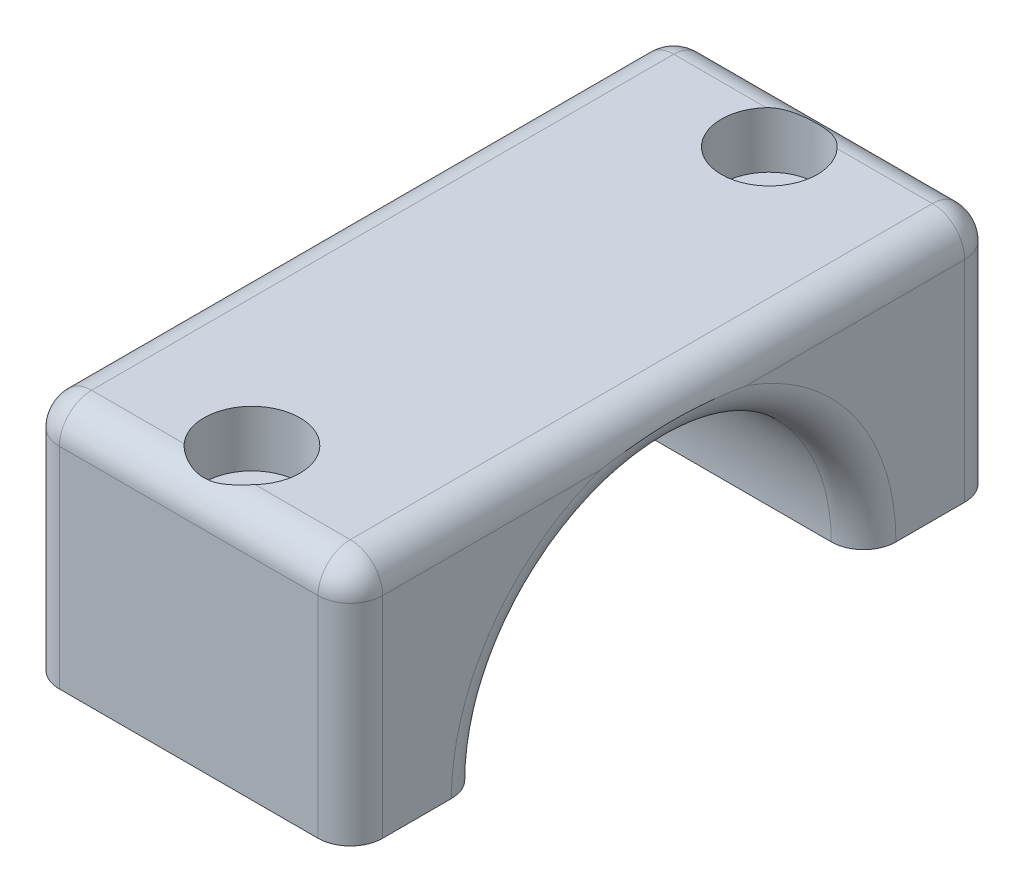
ISO-10303-21;
HEADER;
FILE_DESCRIPTION(('STEP AP214'),'2;1');
FILE_NAME('part.step','',(''),(''),'','','');
FILE_SCHEMA(('AUTOMOTIVE_DESIGN { 1 0 10303 214 1 1 1 1 }'));
ENDSEC;
DATA;
#1=APPLICATION_CONTEXT('core data for automotive mechanical design processes');
#2=APPLICATION_PROTOCOL_DEFINITION('international standard','automotive_design',2000,#1);
#3=PRODUCT_CONTEXT('',#1,'mechanical');
#4=PRODUCT('Part','Part','',(#3));
#5=PRODUCT_RELATED_PRODUCT_CATEGORY('part','',(#4));
#6=PRODUCT_DEFINITION_FORMATION('','',#4);
#7=PRODUCT_DEFINITION_CONTEXT('part definition',#1,'design');
#8=PRODUCT_DEFINITION('design','',#6,#7);
#9=PRODUCT_DEFINITION_SHAPE('','',#8);
#10=(LENGTH_UNIT() NAMED_UNIT(*) SI_UNIT(.MILLI.,.METRE.));
#11=(NAMED_UNIT(*) PLANE_ANGLE_UNIT() SI_UNIT($,.RADIAN.));
#12=(NAMED_UNIT(*) SI_UNIT($,.STERADIAN.) SOLID_ANGLE_UNIT());
#13=UNCERTAINTY_MEASURE_WITH_UNIT(LENGTH_MEASURE(1.E-05),#10,'distance_accuracy_value','');
#14=(GEOMETRIC_REPRESENTATION_CONTEXT(3) GLOBAL_UNCERTAINTY_ASSIGNED_CONTEXT((#13)) GLOBAL_UNIT_ASSIGNED_CONTEXT((#10,
#11,#12)) REPRESENTATION_CONTEXT('',''));
#15=CARTESIAN_POINT('',(0.,0.,0.));
#16=DIRECTION('',(0.,0.,1.));
#17=DIRECTION('',(1.,0.,0.));
#18=AXIS2_PLACEMENT_3D('',#15,#16,#17);
#19=CARTESIAN_POINT('',(0.,0.,0.));
#20=DIRECTION('',(-1.,0.,0.));
#21=DIRECTION('',(0.,0.,1.));
#22=AXIS2_PLACEMENT_3D('',#19,#20,#21);
#23=PLANE('',#22);
#24=DIRECTION('',(0.,0.,-1.));
#25=VECTOR('',#24,1.);
#26=CARTESIAN_POINT('',(0.,0.,0.));
#27=LINE('',#26,#25);
#28=CARTESIAN_POINT('',(0.,0.,-42.8625));
#29=VERTEX_POINT('',#28);
#30=CARTESIAN_POINT('',(0.,0.,-48.26));
#31=VERTEX_POINT('',#30);
#32=EDGE_CURVE('E452',#29,#31,#27,.T.);
#33=ORIENTED_EDGE('',*,*,#32,.F.);
#34=CARTESIAN_POINT('',(0.,0.,-25.4));
#35=DIRECTION('',(-1.,0.,0.));
#36=DIRECTION('',(0.,0.,1.));
#37=AXIS2_PLACEMENT_3D('',#34,#35,#36);
#38=CIRCLE('',#37,17.4625);
#39=CARTESIAN_POINT('',(0.,16.51,-31.0884801353261));
#40=VERTEX_POINT('',#39);
#41=EDGE_CURVE('E262',#29,#40,#38,.F.);
#42=ORIENTED_EDGE('',*,*,#41,.T.);
#43=DIRECTION('',(0.,0.,1.));
#44=VECTOR('',#43,1.);
#45=CARTESIAN_POINT('',(0.,16.51,-50.8));
#46=LINE('',#45,#44);
#47=CARTESIAN_POINT('',(0.,16.51,-48.26));
#48=VERTEX_POINT('',#47);
#49=EDGE_CURVE('E259',#40,#48,#46,.F.);
#50=ORIENTED_EDGE('',*,*,#49,.T.);
#51=DIRECTION('',(0.,1.,0.));
#52=VECTOR('',#51,1.);
#53=CARTESIAN_POINT('',(0.,0.,-48.26));
#54=LINE('',#53,#52);
#55=EDGE_CURVE('E256',#48,#31,#54,.F.);
#56=ORIENTED_EDGE('',*,*,#55,.T.);
#57=EDGE_LOOP('',(#33,#42,#50,#56));
#58=FACE_BOUND('',#57,.T.);
#59=ADVANCED_FACE('F42',(#58),#23,.T.);
#60=CARTESIAN_POINT('',(25.4,0.,0.));
#61=DIRECTION('',(-1.,0.,0.));
#62=DIRECTION('',(0.,0.,1.));
#63=AXIS2_PLACEMENT_3D('',#60,#61,#62);
#64=PLANE('',#63);
#65=DIRECTION('',(0.,0.,1.));
#66=VECTOR('',#65,1.);
#67=CARTESIAN_POINT('',(25.4,16.51,0.));
#68=LINE('',#67,#66);
#69=CARTESIAN_POINT('',(25.4,16.51,-48.26));
#70=VERTEX_POINT('',#69);
#71=CARTESIAN_POINT('',(25.4,16.51,-31.0884801353261));
#72=VERTEX_POINT('',#71);
#73=EDGE_CURVE('E234',#70,#72,#68,.T.);
#74=ORIENTED_EDGE('',*,*,#73,.T.);
#75=CARTESIAN_POINT('',(25.4,0.,-25.4));
#76=DIRECTION('',(-1.,0.,0.));
#77=DIRECTION('',(0.,0.,1.));
#78=AXIS2_PLACEMENT_3D('',#75,#76,#77);
#79=CIRCLE('',#78,17.4625);
#80=CARTESIAN_POINT('',(25.4,0.,-42.8625));
#81=VERTEX_POINT('',#80);
#82=EDGE_CURVE('E237',#72,#81,#79,.T.);
#83=ORIENTED_EDGE('',*,*,#82,.T.);
#84=DIRECTION('',(0.,0.,-1.));
#85=VECTOR('',#84,1.);
#86=CARTESIAN_POINT('',(25.4,0.,0.));
#87=LINE('',#86,#85);
#88=CARTESIAN_POINT('',(25.4,0.,-48.26));
#89=VERTEX_POINT('',#88);
#90=EDGE_CURVE('E180',#81,#89,#87,.T.);
#91=ORIENTED_EDGE('',*,*,#90,.T.);
#92=DIRECTION('',(0.,1.,0.));
#93=VECTOR('',#92,1.);
#94=CARTESIAN_POINT('',(25.4,0.,-48.26));
#95=LINE('',#94,#93);
#96=EDGE_CURVE('E231',#89,#70,#95,.T.);
#97=ORIENTED_EDGE('',*,*,#96,.T.);
#98=EDGE_LOOP('',(#74,#83,#91,#97));
#99=FACE_BOUND('',#98,.T.);
#100=ADVANCED_FACE('F323',(#99),#64,.F.);
#101=CARTESIAN_POINT('',(25.4,0.,0.));
#102=DIRECTION('',(0.,1.,0.));
#103=DIRECTION('',(0.,0.,1.));
#104=AXIS2_PLACEMENT_3D('',#101,#102,#103);
#105=PLANE('',#104);
#106=CARTESIAN_POINT('',(12.5946208289048,0.,-5.08));
#107=DIRECTION('',(0.,1.,0.));
#108=DIRECTION('',(0.,0.,1.));
#109=AXIS2_PLACEMENT_3D('',#106,#107,#108);
#110=CIRCLE('',#109,2.15265000000001);
#111=CARTESIAN_POINT('',(12.5946208289048,0.,-2.92734999999999));
#112=VERTEX_POINT('',#111);
#113=EDGE_CURVE('E431',#112,#112,#110,.T.);
#114=ORIENTED_EDGE('',*,*,#113,.T.);
#115=EDGE_LOOP('',(#114));
#116=FACE_BOUND('',#115,.T.);
#117=DIRECTION('',(1.,0.,0.));
#118=VECTOR('',#117,1.);
#119=CARTESIAN_POINT('',(0.,0.,-10.4775));
#120=LINE('',#119,#118);
#121=CARTESIAN_POINT('',(2.54,0.,-10.4775));
#122=VERTEX_POINT('',#121);
#123=CARTESIAN_POINT('',(22.86,0.,-10.4775));
#124=VERTEX_POINT('',#123);
#125=EDGE_CURVE('E197',#122,#124,#120,.T.);
#126=ORIENTED_EDGE('',*,*,#125,.T.);
#127=CARTESIAN_POINT('',(22.86,0.,-7.9375));
#128=DIRECTION('',(0.,1.,0.));
#129=DIRECTION('',(0.,0.,1.));
#130=AXIS2_PLACEMENT_3D('',#127,#128,#129);
#131=CIRCLE('',#130,2.54);
#132=CARTESIAN_POINT('',(25.4,0.,-7.9375));
#133=VERTEX_POINT('',#132);
#134=EDGE_CURVE('E203',#124,#133,#131,.F.);
#135=ORIENTED_EDGE('',*,*,#134,.T.);
#136=CARTESIAN_POINT('',(25.4,0.,-2.54));
#137=VERTEX_POINT('',#136);
#138=EDGE_CURVE('E455',#137,#133,#87,.T.);
#139=ORIENTED_EDGE('',*,*,#138,.F.);
#140=CARTESIAN_POINT('',(22.86,0.,-2.54));
#141=DIRECTION('',(0.,1.,0.));
#142=DIRECTION('',(0.,0.,1.));
#143=AXIS2_PLACEMENT_3D('',#140,#141,#142);
#144=CIRCLE('',#143,2.54);
#145=CARTESIAN_POINT('',(22.86,0.,0.));
#146=VERTEX_POINT('',#145);
#147=EDGE_CURVE('E209',#137,#146,#144,.F.);
#148=ORIENTED_EDGE('',*,*,#147,.T.);
#149=DIRECTION('',(-1.,0.,0.));
#150=VECTOR('',#149,1.);
#151=CARTESIAN_POINT('',(25.4,0.,0.));
#152=LINE('',#151,#150);
#153=CARTESIAN_POINT('',(2.54,0.,0.));
#154=VERTEX_POINT('',#153);
#155=EDGE_CURVE('E211',#146,#154,#152,.T.);
#156=ORIENTED_EDGE('',*,*,#155,.T.);
#157=CARTESIAN_POINT('',(2.54,0.,-2.54));
#158=DIRECTION('',(0.,1.,0.));
#159=DIRECTION('',(0.,0.,1.));
#160=AXIS2_PLACEMENT_3D('',#157,#158,#159);
#161=CIRCLE('',#160,2.54);
#162=CARTESIAN_POINT('',(0.,0.,-2.54));
#163=VERTEX_POINT('',#162);
#164=EDGE_CURVE('E205',#154,#163,#161,.F.);
#165=ORIENTED_EDGE('',*,*,#164,.T.);
#166=CARTESIAN_POINT('',(0.,0.,-7.9375));
#167=VERTEX_POINT('',#166);
#168=EDGE_CURVE('E456',#163,#167,#27,.T.);
#169=ORIENTED_EDGE('',*,*,#168,.T.);
#170=CARTESIAN_POINT('',(2.54,0.,-7.9375));
#171=DIRECTION('',(0.,1.,0.));
#172=DIRECTION('',(0.,0.,1.));
#173=AXIS2_PLACEMENT_3D('',#170,#171,#172);
#174=CIRCLE('',#173,2.54);
#175=EDGE_CURVE('E217',#167,#122,#174,.F.);
#176=ORIENTED_EDGE('',*,*,#175,.T.);
#177=EDGE_LOOP('',(#126,#135,#139,#148,#156,#165,#169,#176));
#178=FACE_BOUND('',#177,.T.);
#179=ADVANCED_FACE('F338',(#116,#178),#105,.F.);
#180=CARTESIAN_POINT('',(25.4,0.,0.));
#181=DIRECTION('',(0.,0.,-1.));
#182=DIRECTION('',(-1.,0.,0.));
#183=AXIS2_PLACEMENT_3D('',#180,#181,#182);
#184=PLANE('',#183);
#185=ORIENTED_EDGE('',*,*,#155,.F.);
#186=DIRECTION('',(0.,-1.,0.));
#187=VECTOR('',#186,1.);
#188=CARTESIAN_POINT('',(22.86,0.,0.));
#189=LINE('',#188,#187);
#190=CARTESIAN_POINT('',(22.86,16.51,0.));
#191=VERTEX_POINT('',#190);
#192=EDGE_CURVE('E58',#146,#191,#189,.F.);
#193=ORIENTED_EDGE('',*,*,#192,.T.);
#194=DIRECTION('',(-1.,0.,0.));
#195=VECTOR('',#194,1.);
#196=CARTESIAN_POINT('',(25.4,16.51,0.));
#197=LINE('',#196,#195);
#198=CARTESIAN_POINT('',(2.54,16.51,0.));
#199=VERTEX_POINT('',#198);
#200=EDGE_CURVE('E69',#191,#199,#197,.T.);
#201=ORIENTED_EDGE('',*,*,#200,.T.);
#202=DIRECTION('',(0.,-1.,0.));
#203=VECTOR('',#202,1.);
#204=CARTESIAN_POINT('',(2.54,0.,0.));
#205=LINE('',#204,#203);
#206=EDGE_CURVE('E473',#199,#154,#205,.T.);
#207=ORIENTED_EDGE('',*,*,#206,.T.);
#208=EDGE_LOOP('',(#185,#193,#201,#207));
#209=FACE_BOUND('',#208,.T.);
#210=ADVANCED_FACE('F336',(#209),#184,.F.);
#211=CARTESIAN_POINT('',(12.5946208289048,0.,-45.72));
#212=DIRECTION('',(0.,1.,0.));
#213=DIRECTION('',(0.,0.,1.));
#214=AXIS2_PLACEMENT_3D('',#211,#212,#213);
#215=CIRCLE('',#214,2.15265000000001);
#216=CARTESIAN_POINT('',(12.5946208289048,0.,-43.56735));
#217=VERTEX_POINT('',#216);
#218=EDGE_CURVE('E198',#217,#217,#215,.T.);
#219=ORIENTED_EDGE('',*,*,#218,.T.);
#220=EDGE_LOOP('',(#219));
#221=FACE_BOUND('',#220,.T.);
#222=ORIENTED_EDGE('',*,*,#90,.F.);
#223=CARTESIAN_POINT('',(22.86,0.,-42.8625));
#224=DIRECTION('',(0.,1.,0.));
#225=DIRECTION('',(0.,0.,1.));
#226=AXIS2_PLACEMENT_3D('',#223,#224,#225);
#227=CIRCLE('',#226,2.54);
#228=CARTESIAN_POINT('',(22.86,0.,-40.3225));
#229=VERTEX_POINT('',#228);
#230=EDGE_CURVE('E174',#81,#229,#227,.F.);
#231=ORIENTED_EDGE('',*,*,#230,.T.);
#232=DIRECTION('',(1.,0.,0.));
#233=VECTOR('',#232,1.);
#234=CARTESIAN_POINT('',(0.,0.,-40.3225));
#235=LINE('',#234,#233);
#236=CARTESIAN_POINT('',(2.54,0.,-40.3225));
#237=VERTEX_POINT('',#236);
#238=EDGE_CURVE('E177',#229,#237,#235,.F.);
#239=ORIENTED_EDGE('',*,*,#238,.T.);
#240=CARTESIAN_POINT('',(2.54,0.,-42.8625));
#241=DIRECTION('',(0.,1.,0.));
#242=DIRECTION('',(0.,0.,1.));
#243=AXIS2_PLACEMENT_3D('',#240,#241,#242);
#244=CIRCLE('',#243,2.54);
#245=EDGE_CURVE('E186',#237,#29,#244,.F.);
#246=ORIENTED_EDGE('',*,*,#245,.T.);
#247=ORIENTED_EDGE('',*,*,#32,.T.);
#248=CARTESIAN_POINT('',(2.54,0.,-48.26));
#249=DIRECTION('',(0.,1.,0.));
#250=DIRECTION('',(0.,0.,1.));
#251=AXIS2_PLACEMENT_3D('',#248,#249,#250);
#252=CIRCLE('',#251,2.54);
#253=CARTESIAN_POINT('',(2.54,0.,-50.8));
#254=VERTEX_POINT('',#253);
#255=EDGE_CURVE('E240',#31,#254,#252,.F.);
#256=ORIENTED_EDGE('',*,*,#255,.T.);
#257=DIRECTION('',(-1.,0.,0.));
#258=VECTOR('',#257,1.);
#259=CARTESIAN_POINT('',(25.4,0.,-50.8));
#260=LINE('',#259,#258);
#261=CARTESIAN_POINT('',(22.86,0.,-50.8));
#262=VERTEX_POINT('',#261);
#263=EDGE_CURVE('E460',#262,#254,#260,.T.);
#264=ORIENTED_EDGE('',*,*,#263,.F.);
#265=CARTESIAN_POINT('',(22.86,0.,-48.26));
#266=DIRECTION('',(0.,1.,0.));
#267=DIRECTION('',(0.,0.,1.));
#268=AXIS2_PLACEMENT_3D('',#265,#266,#267);
#269=CIRCLE('',#268,2.54);
#270=EDGE_CURVE('E243',#262,#89,#269,.F.);
#271=ORIENTED_EDGE('',*,*,#270,.T.);
#272=EDGE_LOOP('',(#222,#231,#239,#246,#247,#256,#264,#271));
#273=FACE_BOUND('',#272,.T.);
#274=ADVANCED_FACE('F176',(#221,#273),#105,.F.);
#275=CARTESIAN_POINT('',(25.4,0.,-50.8));
#276=DIRECTION('',(0.,0.,1.));
#277=DIRECTION('',(1.,0.,0.));
#278=AXIS2_PLACEMENT_3D('',#275,#276,#277);
#279=PLANE('',#278);
#280=DIRECTION('',(-1.,0.,0.));
#281=VECTOR('',#280,1.);
#282=CARTESIAN_POINT('',(25.4,16.51,-50.8));
#283=LINE('',#282,#281);
#284=CARTESIAN_POINT('',(2.54,16.51,-50.8));
#285=VERTEX_POINT('',#284);
#286=CARTESIAN_POINT('',(22.86,16.51,-50.8));
#287=VERTEX_POINT('',#286);
#288=EDGE_CURVE('E491',#285,#287,#283,.F.);
#289=ORIENTED_EDGE('',*,*,#288,.T.);
#290=DIRECTION('',(0.,1.,0.));
#291=VECTOR('',#290,1.);
#292=CARTESIAN_POINT('',(22.86,0.,-50.8));
#293=LINE('',#292,#291);
#294=EDGE_CURVE('E506',#287,#262,#293,.F.);
#295=ORIENTED_EDGE('',*,*,#294,.T.);
#296=ORIENTED_EDGE('',*,*,#263,.T.);
#297=DIRECTION('',(0.,1.,0.));
#298=VECTOR('',#297,1.);
#299=CARTESIAN_POINT('',(2.54,19.05,-50.8));
#300=LINE('',#299,#298);
#301=EDGE_CURVE('E293',#254,#285,#300,.T.);
#302=ORIENTED_EDGE('',*,*,#301,.T.);
#303=EDGE_LOOP('',(#289,#295,#296,#302));
#304=FACE_BOUND('',#303,.T.);
#305=ADVANCED_FACE('F329',(#304),#279,.F.);
#306=CARTESIAN_POINT('',(25.4,19.05,0.));
#307=DIRECTION('',(0.,-1.,0.));
#308=DIRECTION('',(0.,0.,-1.));
#309=AXIS2_PLACEMENT_3D('',#306,#307,#308);
#310=PLANE('',#309);
#311=DIRECTION('',(0.,0.,1.));
#312=VECTOR('',#311,1.);
#313=CARTESIAN_POINT('',(22.86,19.05,0.));
#314=LINE('',#313,#312);
#315=CARTESIAN_POINT('',(22.86,19.05,-2.54));
#316=VERTEX_POINT('',#315);
#317=CARTESIAN_POINT('',(22.86,19.05,-48.26));
#318=VERTEX_POINT('',#317);
#319=EDGE_CURVE('E277',#316,#318,#314,.F.);
#320=ORIENTED_EDGE('',*,*,#319,.T.);
#321=DIRECTION('',(-1.,0.,0.));
#322=VECTOR('',#321,1.);
#323=CARTESIAN_POINT('',(25.4,19.05,-48.26));
#324=LINE('',#323,#322);
#325=CARTESIAN_POINT('',(15.3813842915798,19.05,-48.26));
#326=VERTEX_POINT('',#325);
#327=EDGE_CURVE('E280',#318,#326,#324,.T.);
#328=ORIENTED_EDGE('',*,*,#327,.T.);
#329=CARTESIAN_POINT('',(12.5946208289048,19.05,-45.72));
#330=DIRECTION('',(0.,1.,0.));
#331=DIRECTION('',(0.,0.,1.));
#332=AXIS2_PLACEMENT_3D('',#329,#330,#331);
#333=CIRCLE('',#332,3.77063);
#334=CARTESIAN_POINT('',(9.80785736622992,19.05,-48.26));
#335=VERTEX_POINT('',#334);
#336=EDGE_CURVE('E435',#335,#326,#333,.T.);
#337=ORIENTED_EDGE('',*,*,#336,.F.);
#338=DIRECTION('',(-1.,0.,0.));
#339=VECTOR('',#338,1.);
#340=CARTESIAN_POINT('',(25.4,19.05,-48.26));
#341=LINE('',#340,#339);
#342=CARTESIAN_POINT('',(2.54,19.05,-48.26));
#343=VERTEX_POINT('',#342);
#344=EDGE_CURVE('E271',#335,#343,#341,.T.);
#345=ORIENTED_EDGE('',*,*,#344,.T.);
#346=DIRECTION('',(0.,0.,1.));
#347=VECTOR('',#346,1.);
#348=CARTESIAN_POINT('',(2.54,19.05,0.));
#349=LINE('',#348,#347);
#350=CARTESIAN_POINT('',(2.54,19.05,-2.54));
#351=VERTEX_POINT('',#350);
#352=EDGE_CURVE('E265',#343,#351,#349,.T.);
#353=ORIENTED_EDGE('',*,*,#352,.T.);
#354=DIRECTION('',(-1.,0.,0.));
#355=VECTOR('',#354,1.);
#356=CARTESIAN_POINT('',(25.4,19.05,-2.54));
#357=LINE('',#356,#355);
#358=CARTESIAN_POINT('',(9.80785736622992,19.05,-2.54));
#359=VERTEX_POINT('',#358);
#360=EDGE_CURVE('E268',#351,#359,#357,.F.);
#361=ORIENTED_EDGE('',*,*,#360,.T.);
#362=CARTESIAN_POINT('',(12.5946208289048,19.05,-5.08));
#363=DIRECTION('',(0.,1.,0.));
#364=DIRECTION('',(0.,0.,1.));
#365=AXIS2_PLACEMENT_3D('',#362,#363,#364);
#366=CIRCLE('',#365,3.77063);
#367=CARTESIAN_POINT('',(15.3813842915798,19.05,-2.54));
#368=VERTEX_POINT('',#367);
#369=EDGE_CURVE('E411',#368,#359,#366,.T.);
#370=ORIENTED_EDGE('',*,*,#369,.F.);
#371=DIRECTION('',(-1.,0.,0.));
#372=VECTOR('',#371,1.);
#373=CARTESIAN_POINT('',(25.4,19.05,-2.54));
#374=LINE('',#373,#372);
#375=EDGE_CURVE('E274',#368,#316,#374,.F.);
#376=ORIENTED_EDGE('',*,*,#375,.T.);
#377=EDGE_LOOP('',(#320,#328,#337,#345,#353,#361,#370,#376));
#378=FACE_BOUND('',#377,.T.);
#379=ADVANCED_FACE('F321',(#378),#310,.F.);
#380=ORIENTED_EDGE('',*,*,#138,.T.);
#381=CARTESIAN_POINT('',(25.4,0.,-25.4));
#382=DIRECTION('',(-1.,0.,0.));
#383=DIRECTION('',(0.,0.,1.));
#384=AXIS2_PLACEMENT_3D('',#381,#382,#383);
#385=CIRCLE('',#384,17.4625);
#386=CARTESIAN_POINT('',(25.4,16.51,-19.7115198646739));
#387=VERTEX_POINT('',#386);
#388=EDGE_CURVE('E228',#133,#387,#385,.T.);
#389=ORIENTED_EDGE('',*,*,#388,.T.);
#390=DIRECTION('',(0.,0.,1.));
#391=VECTOR('',#390,1.);
#392=CARTESIAN_POINT('',(25.4,16.51,0.));
#393=LINE('',#392,#391);
#394=CARTESIAN_POINT('',(25.4,16.51,-2.54));
#395=VERTEX_POINT('',#394);
#396=EDGE_CURVE('E225',#387,#395,#393,.T.);
#397=ORIENTED_EDGE('',*,*,#396,.T.);
#398=DIRECTION('',(0.,-1.,0.));
#399=VECTOR('',#398,1.);
#400=CARTESIAN_POINT('',(25.4,0.,-2.54));
#401=LINE('',#400,#399);
#402=EDGE_CURVE('E222',#395,#137,#401,.T.);
#403=ORIENTED_EDGE('',*,*,#402,.T.);
#404=EDGE_LOOP('',(#380,#389,#397,#403));
#405=FACE_BOUND('',#404,.T.);
#406=ADVANCED_FACE('F318',(#405),#64,.F.);
#407=DIRECTION('',(0.,0.,1.));
#408=VECTOR('',#407,1.);
#409=CARTESIAN_POINT('',(0.,16.51,-50.8));
#410=LINE('',#409,#408);
#411=CARTESIAN_POINT('',(0.,16.51,-2.54));
#412=VERTEX_POINT('',#411);
#413=CARTESIAN_POINT('',(0.,16.51,-19.7115198646739));
#414=VERTEX_POINT('',#413);
#415=EDGE_CURVE('E250',#412,#414,#410,.F.);
#416=ORIENTED_EDGE('',*,*,#415,.T.);
#417=CARTESIAN_POINT('',(0.,0.,-25.4));
#418=DIRECTION('',(-1.,0.,0.));
#419=DIRECTION('',(0.,0.,1.));
#420=AXIS2_PLACEMENT_3D('',#417,#418,#419);
#421=CIRCLE('',#420,17.4625);
#422=EDGE_CURVE('E253',#414,#167,#421,.F.);
#423=ORIENTED_EDGE('',*,*,#422,.T.);
#424=ORIENTED_EDGE('',*,*,#168,.F.);
#425=DIRECTION('',(0.,-1.,0.));
#426=VECTOR('',#425,1.);
#427=CARTESIAN_POINT('',(0.,19.05,-2.54));
#428=LINE('',#427,#426);
#429=EDGE_CURVE('E185',#163,#412,#428,.F.);
#430=ORIENTED_EDGE('',*,*,#429,.T.);
#431=EDGE_LOOP('',(#416,#423,#424,#430));
#432=FACE_BOUND('',#431,.T.);
#433=ADVANCED_FACE('F317',(#432),#23,.T.);
#434=CARTESIAN_POINT('',(0.,0.,-25.4));
#435=DIRECTION('',(1.,0.,0.));
#436=DIRECTION('',(0.,0.,-1.));
#437=AXIS2_PLACEMENT_3D('',#434,#435,#436);
#438=CYLINDRICAL_SURFACE('',#437,14.9225);
#439=ORIENTED_EDGE('',*,*,#238,.F.);
#440=CARTESIAN_POINT('',(22.86,0.,-25.4));
#441=DIRECTION('',(-1.,0.,0.));
#442=DIRECTION('',(0.,0.,1.));
#443=AXIS2_PLACEMENT_3D('',#440,#441,#442);
#444=CIRCLE('',#443,14.9225);
#445=EDGE_CURVE('E192',#229,#124,#444,.F.);
#446=ORIENTED_EDGE('',*,*,#445,.T.);
#447=ORIENTED_EDGE('',*,*,#125,.F.);
#448=CARTESIAN_POINT('',(2.54,0.,-25.4));
#449=DIRECTION('',(-1.,0.,0.));
#450=DIRECTION('',(0.,0.,1.));
#451=AXIS2_PLACEMENT_3D('',#448,#449,#450);
#452=CIRCLE('',#451,14.9225);
#453=EDGE_CURVE('E195',#122,#237,#452,.T.);
#454=ORIENTED_EDGE('',*,*,#453,.T.);
#455=EDGE_LOOP('',(#439,#446,#447,#454));
#456=FACE_BOUND('',#455,.T.);
#457=ADVANCED_FACE('F190',(#456),#438,.F.);
#458=CARTESIAN_POINT('',(12.5946208289048,19.05,-45.72));
#459=DIRECTION('',(0.,1.,0.));
#460=DIRECTION('',(0.,0.,1.));
#461=AXIS2_PLACEMENT_3D('',#458,#459,#460);
#462=CYLINDRICAL_SURFACE('',#461,2.15265);
#463=ORIENTED_EDGE('',*,*,#218,.F.);
#464=EDGE_LOOP('',(#463));
#465=FACE_BOUND('',#464,.T.);
#466=CARTESIAN_POINT('',(12.5946208289048,14.6558,-45.72));
#467=DIRECTION('',(0.,1.,0.));
#468=DIRECTION('',(0.,0.,1.));
#469=AXIS2_PLACEMENT_3D('',#466,#467,#468);
#470=CIRCLE('',#469,2.15265);
#471=CARTESIAN_POINT('',(12.5946208289048,14.6558,-43.56735));
#472=VERTEX_POINT('',#471);
#473=EDGE_CURVE('E443',#472,#472,#470,.T.);
#474=ORIENTED_EDGE('',*,*,#473,.T.);
#475=EDGE_LOOP('',(#474));
#476=FACE_BOUND('',#475,.T.);
#477=ADVANCED_FACE('F310',(#465,#476),#462,.F.);
#478=CARTESIAN_POINT('',(14.7472708289048,14.6558,-45.72));
#479=DIRECTION('',(0.,-1.,0.));
#480=DIRECTION('',(0.,0.,-1.));
#481=AXIS2_PLACEMENT_3D('',#478,#479,#480);
#482=PLANE('',#481);
#483=ORIENTED_EDGE('',*,*,#473,.F.);
#484=EDGE_LOOP('',(#483));
#485=FACE_BOUND('',#484,.T.);
#486=CARTESIAN_POINT('',(12.5946208289048,14.6558,-45.72));
#487=DIRECTION('',(0.,1.,0.));
#488=DIRECTION('',(0.,0.,1.));
#489=AXIS2_PLACEMENT_3D('',#486,#487,#488);
#490=CIRCLE('',#489,3.77063);
#491=CARTESIAN_POINT('',(12.5946208289048,14.6558,-41.94937));
#492=VERTEX_POINT('',#491);
#493=EDGE_CURVE('E439',#492,#492,#490,.T.);
#494=ORIENTED_EDGE('',*,*,#493,.T.);
#495=EDGE_LOOP('',(#494));
#496=FACE_BOUND('',#495,.T.);
#497=ADVANCED_FACE('F305',(#485,#496),#482,.F.);
#498=CARTESIAN_POINT('',(12.5946208289048,19.05,-45.72));
#499=DIRECTION('',(0.,1.,0.));
#500=DIRECTION('',(0.,0.,1.));
#501=AXIS2_PLACEMENT_3D('',#498,#499,#500);
#502=CYLINDRICAL_SURFACE('',#501,3.77063);
#503=ORIENTED_EDGE('',*,*,#493,.F.);
#504=EDGE_LOOP('',(#503));
#505=FACE_BOUND('',#504,.T.);
#506=ORIENTED_EDGE('',*,*,#336,.T.);
#507=CARTESIAN_POINT('',(15.3813842915798,19.05,-48.26));
#508=CARTESIAN_POINT('',(15.3080520427791,19.0499900330073,-48.3404861586849));
#509=CARTESIAN_POINT('',(15.2312874852604,19.0461772158392,-48.4176791885479));
#510=CARTESIAN_POINT('',(15.0717897408338,19.0327253562551,-48.5648191956909));
#511=CARTESIAN_POINT('',(14.9890667381085,19.0230960565977,-48.6347780613824));
#512=CARTESIAN_POINT('',(14.8184875250494,18.9998047364336,-48.7669155792167));
#513=CARTESIAN_POINT('',(14.7306431165243,18.9861517148356,-48.8291111564698));
#514=CARTESIAN_POINT('',(14.5502654527886,18.9564533599598,-48.9456235879597));
#515=CARTESIAN_POINT('',(14.4577305213677,18.94040716742,-48.9999375984633));
#516=CARTESIAN_POINT('',(14.1940215477048,18.8945762530219,-49.1399631057879));
#517=CARTESIAN_POINT('',(14.0181556405014,18.8638978583135,-49.2168378327073));
#518=CARTESIAN_POINT('',(13.74673682327,18.8223468362823,-49.3115860028274));
#519=CARTESIAN_POINT('',(13.6549628778053,18.8092373961355,-49.3397472027104));
#520=CARTESIAN_POINT('',(13.4692509797454,18.7854362602128,-49.3890445342811));
#521=CARTESIAN_POINT('',(13.3753140186119,18.7747434800981,-49.4101838186625));
#522=CARTESIAN_POINT('',(13.176590217607,18.7557133170279,-49.4469477348102));
#523=CARTESIAN_POINT('',(13.0716347864068,18.7477050123855,-49.4618385535159));
#524=CARTESIAN_POINT('',(12.8605833208545,18.7363575623638,-49.4827326123262));
#525=CARTESIAN_POINT('',(12.7544872819049,18.7330184358118,-49.4887358165936));
#526=CARTESIAN_POINT('',(12.5421877596963,18.7313449365675,-49.4917588925848));
#527=CARTESIAN_POINT('',(12.4359843728738,18.7330076964472,-49.4887839112237));
#528=CARTESIAN_POINT('',(12.2244003055153,18.7411645096479,-49.4739092689426));
#529=CARTESIAN_POINT('',(12.1190195915896,18.7476583658493,-49.4620099721549));
#530=CARTESIAN_POINT('',(11.9219763105278,18.7638515875336,-49.4313302458349));
#531=CARTESIAN_POINT('',(11.8301267912632,18.7730977929495,-49.4134957417934));
#532=CARTESIAN_POINT('',(11.6482761977089,18.7941912367456,-49.3711372264977));
#533=CARTESIAN_POINT('',(11.5582757041584,18.8060392790516,-49.3466111470849));
#534=CARTESIAN_POINT('',(11.2914447685517,18.8443090397349,-49.2631836860609));
#535=CARTESIAN_POINT('',(11.1180035339161,18.8734349659221,-49.1944675834051));
#536=CARTESIAN_POINT('',(10.7647352551622,18.9344757234976,-49.0232936095011));
#537=CARTESIAN_POINT('',(10.5862716690131,18.9663486300446,-48.9179749847991));
#538=CARTESIAN_POINT('',(10.3328707830189,19.0052204817045,-48.7387446557788));
#539=CARTESIAN_POINT('',(10.2508877615049,19.0166786710074,-48.6755591539725));
#540=CARTESIAN_POINT('',(10.092136396857,19.0351457589363,-48.5423970924458));
#541=CARTESIAN_POINT('',(10.0153629634122,19.042159058254,-48.4724273289318));
#542=CARTESIAN_POINT('',(9.91869482266076,19.0474186316503,-48.3767102239969));
#543=CARTESIAN_POINT('',(9.89611310205699,19.0483749823596,-48.3537699893348));
#544=CARTESIAN_POINT('',(9.85153978352871,19.0496655272492,-48.3073136167821));
#545=CARTESIAN_POINT('',(9.8295480886678,19.0499998242524,-48.2837975747212));
#546=CARTESIAN_POINT('',(9.80785736622992,19.05,-48.26));
#547=B_SPLINE_CURVE_WITH_KNOTS('',3,(#507,#508,#509,#510,#511,#512,#513,#514,#515,#516,#517,
#518,#519,#520,#521,#522,#523,#524,#525,#526,#527,#528,#529,#530,#531,#532,#533,#534,#535,#536,
#537,#538,#539,#540,#541,#542,#543,#544,#545,#546),.UNSPECIFIED.,.F.,.F.,(4,2,2,2,2,2,2,2,2,2,2,
2,2,2,2,2,2,2,2,4),(0.,0.326306164795723,0.652067268152037,0.977105276869988,1.3022602718867,
1.88274728800758,2.17317931767882,2.46348077261036,2.78194123409229,3.10040297968255,
3.41868219572245,3.7369484259569,4.01870583239246,4.3005504201486,4.86489956171498,
5.49074220862864,5.80281835954248,6.11458505281981,6.21118523839865,6.30776945494839),.UNSPECIFIED.);
#548=EDGE_CURVE('E284',#326,#335,#547,.T.);
#549=ORIENTED_EDGE('',*,*,#548,.T.);
#550=EDGE_LOOP('',(#506,#549));
#551=FACE_BOUND('',#550,.T.);
#552=ADVANCED_FACE('F299',(#505,#551),#502,.F.);
#553=CARTESIAN_POINT('',(12.5946208289048,19.05,-5.08));
#554=DIRECTION('',(0.,1.,0.));
#555=DIRECTION('',(0.,0.,1.));
#556=AXIS2_PLACEMENT_3D('',#553,#554,#555);
#557=CYLINDRICAL_SURFACE('',#556,2.15265);
#558=ORIENTED_EDGE('',*,*,#113,.F.);
#559=EDGE_LOOP('',(#558));
#560=FACE_BOUND('',#559,.T.);
#561=CARTESIAN_POINT('',(12.5946208289048,14.6558,-5.08));
#562=DIRECTION('',(0.,1.,0.));
#563=DIRECTION('',(0.,0.,1.));
#564=AXIS2_PLACEMENT_3D('',#561,#562,#563);
#565=CIRCLE('',#564,2.15265);
#566=CARTESIAN_POINT('',(12.5946208289048,14.6558,-2.92735));
#567=VERTEX_POINT('',#566);
#568=EDGE_CURVE('E425',#567,#567,#565,.T.);
#569=ORIENTED_EDGE('',*,*,#568,.T.);
#570=EDGE_LOOP('',(#569));
#571=FACE_BOUND('',#570,.T.);
#572=ADVANCED_FACE('F304',(#560,#571),#557,.F.);
#573=CARTESIAN_POINT('',(14.7472708289048,14.6558,-5.08));
#574=DIRECTION('',(0.,-1.,0.));
#575=DIRECTION('',(0.,0.,-1.));
#576=AXIS2_PLACEMENT_3D('',#573,#574,#575);
#577=PLANE('',#576);
#578=ORIENTED_EDGE('',*,*,#568,.F.);
#579=EDGE_LOOP('',(#578));
#580=FACE_BOUND('',#579,.T.);
#581=CARTESIAN_POINT('',(12.5946208289048,14.6558,-5.08));
#582=DIRECTION('',(0.,1.,0.));
#583=DIRECTION('',(0.,0.,1.));
#584=AXIS2_PLACEMENT_3D('',#581,#582,#583);
#585=CIRCLE('',#584,3.77063);
#586=CARTESIAN_POINT('',(12.5946208289048,14.6558,-1.30937));
#587=VERTEX_POINT('',#586);
#588=EDGE_CURVE('E418',#587,#587,#585,.T.);
#589=ORIENTED_EDGE('',*,*,#588,.T.);
#590=EDGE_LOOP('',(#589));
#591=FACE_BOUND('',#590,.T.);
#592=ADVANCED_FACE('F550',(#580,#591),#577,.F.);
#593=CARTESIAN_POINT('',(12.5946208289048,19.05,-5.08));
#594=DIRECTION('',(0.,1.,0.));
#595=DIRECTION('',(0.,0.,1.));
#596=AXIS2_PLACEMENT_3D('',#593,#594,#595);
#597=CYLINDRICAL_SURFACE('',#596,3.77063);
#598=ORIENTED_EDGE('',*,*,#588,.F.);
#599=EDGE_LOOP('',(#598));
#600=FACE_BOUND('',#599,.T.);
#601=ORIENTED_EDGE('',*,*,#369,.T.);
#602=CARTESIAN_POINT('',(9.80785736622992,19.05,-2.54));
#603=CARTESIAN_POINT('',(9.88118961503059,19.0499900330073,-2.45951384131513));
#604=CARTESIAN_POINT('',(9.9579541725493,19.0461772158392,-2.38232081145215));
#605=CARTESIAN_POINT('',(10.1174519169759,19.0327253562551,-2.23518080430906));
#606=CARTESIAN_POINT('',(10.2001749197012,19.0230960565977,-2.16522193861759));
#607=CARTESIAN_POINT('',(10.3707541327603,18.9998047364336,-2.03308442078327));
#608=CARTESIAN_POINT('',(10.4585985412854,18.9861517148356,-1.97088884353019));
#609=CARTESIAN_POINT('',(10.6389762050211,18.9564533599598,-1.85437641204029));
#610=CARTESIAN_POINT('',(10.731511136442,18.94040716742,-1.80006240153675));
#611=CARTESIAN_POINT('',(10.9952201101049,18.8945762530219,-1.66003689421211));
#612=CARTESIAN_POINT('',(11.1710860173083,18.8638978583135,-1.58316216729271));
#613=CARTESIAN_POINT('',(11.4425048345397,18.8223468362823,-1.48841399717259));
#614=CARTESIAN_POINT('',(11.5342787800045,18.8092373961355,-1.46025279728958));
#615=CARTESIAN_POINT('',(11.7199906780643,18.7854362602128,-1.41095546571892));
#616=CARTESIAN_POINT('',(11.8139276391978,18.7747434800981,-1.38981618133749));
#617=CARTESIAN_POINT('',(12.0126514402027,18.7557133170279,-1.35305226518983));
#618=CARTESIAN_POINT('',(12.1176068714029,18.7477050123855,-1.33816144648408));
#619=CARTESIAN_POINT('',(12.3286583369552,18.7363575623638,-1.3172673876738));
#620=CARTESIAN_POINT('',(12.4347543759048,18.7330184358118,-1.31126418340635));
#621=CARTESIAN_POINT('',(12.6470538981134,18.7313449365675,-1.30824110741523));
#622=CARTESIAN_POINT('',(12.7532572849359,18.7330076964472,-1.31121608877635));
#623=CARTESIAN_POINT('',(12.9648413522944,18.7411645096479,-1.32609073105743));
#624=CARTESIAN_POINT('',(13.0702220662201,18.7476583658493,-1.33799002784513));
#625=CARTESIAN_POINT('',(13.2672653472819,18.7638515875336,-1.36866975416505));
#626=CARTESIAN_POINT('',(13.3591148665465,18.7730977929495,-1.38650425820659));
#627=CARTESIAN_POINT('',(13.5409654601008,18.7941912367456,-1.42886277350234));
#628=CARTESIAN_POINT('',(13.6309659536513,18.8060392790516,-1.45338885291505));
#629=CARTESIAN_POINT('',(13.897796889258,18.8443090397349,-1.5368163139391));
#630=CARTESIAN_POINT('',(14.0712381238936,18.8734349659221,-1.60553241659486));
#631=CARTESIAN_POINT('',(14.4245064026475,18.9344757234976,-1.77670639049888));
#632=CARTESIAN_POINT('',(14.6029699887966,18.9663486300446,-1.88202501520087));
#633=CARTESIAN_POINT('',(14.8563708747908,19.0052204817045,-2.06125534422117));
#634=CARTESIAN_POINT('',(14.9383538963048,19.0166786710074,-2.12444084602752));
#635=CARTESIAN_POINT('',(15.0971052609527,19.0351457589363,-2.25760290755416));
#636=CARTESIAN_POINT('',(15.1738786943975,19.042159058254,-2.32757267106816));
#637=CARTESIAN_POINT('',(15.2705468351489,19.0474186316503,-2.42328977600306));
#638=CARTESIAN_POINT('',(15.2931285557527,19.0483749823596,-2.44623001066516));
#639=CARTESIAN_POINT('',(15.337701874281,19.0496655272492,-2.49268638321794));
#640=CARTESIAN_POINT('',(15.3596935691419,19.0499998242524,-2.51620242527883));
#641=CARTESIAN_POINT('',(15.3813842915798,19.05,-2.54));
#642=B_SPLINE_CURVE_WITH_KNOTS('',3,(#602,#603,#604,#605,#606,#607,#608,#609,#610,#611,#612,
#613,#614,#615,#616,#617,#618,#619,#620,#621,#622,#623,#624,#625,#626,#627,#628,#629,#630,#631,
#632,#633,#634,#635,#636,#637,#638,#639,#640,#641),.UNSPECIFIED.,.F.,.F.,(4,2,2,2,2,2,2,2,2,2,2,
2,2,2,2,2,2,2,2,4),(0.,0.326306164795723,0.652067268152033,0.977105276869983,1.3022602718867,
1.88274728800758,2.17317931767882,2.46348077261036,2.78194123409228,3.10040297968255,
3.41868219572245,3.73694842595689,4.01870583239246,4.3005504201486,4.86489956171498,
5.49074220862864,5.80281835954247,6.11458505281981,6.21118523839865,6.30776945494839),.UNSPECIFIED.);
#643=EDGE_CURVE('E11',#359,#368,#642,.T.);
#644=ORIENTED_EDGE('',*,*,#643,.T.);
#645=EDGE_LOOP('',(#601,#644));
#646=FACE_BOUND('',#645,.T.);
#647=ADVANCED_FACE('F544',(#600,#646),#597,.F.);
#648=CARTESIAN_POINT('',(2.54,0.,-25.4));
#649=DIRECTION('',(-1.,0.,0.));
#650=DIRECTION('',(0.,0.,1.));
#651=AXIS2_PLACEMENT_3D('',#648,#649,#650);
#652=TOROIDAL_SURFACE('',#651,17.4625,2.54);
#653=ORIENTED_EDGE('',*,*,#175,.F.);
#654=ORIENTED_EDGE('',*,*,#422,.F.);
#655=CARTESIAN_POINT('',(0.,16.51,-19.7115198646739));
#656=CARTESIAN_POINT('',(6.19475706838487E-09,16.5109721757738,-19.7173258467422));
#657=CARTESIAN_POINT('',(5.64166528568118E-07,16.5119429041782,-19.7231320787853));
#658=CARTESIAN_POINT('',(8.14023230243209E-05,16.5828341145455,-20.1478063053544));
#659=CARTESIAN_POINT('',(0.00300928094063641,16.6452216950716,-20.5679704498431));
#660=CARTESIAN_POINT('',(0.0112091267308309,16.754589916855,-21.4103162695576));
#661=CARTESIAN_POINT('',(0.0164814577514755,16.8015681646885,-21.8324982478771));
#662=CARTESIAN_POINT('',(0.0267658977002802,16.8798868978488,-22.6786149962683));
#663=CARTESIAN_POINT('',(0.0317778239157892,16.9112165326424,-23.102550777603));
#664=CARTESIAN_POINT('',(0.0397083463227468,16.9580120685356,-23.9513111564553));
#665=CARTESIAN_POINT('',(0.0426270225196492,16.9734785759445,-24.3761357193804));
#666=CARTESIAN_POINT('',(0.044922127159882,16.9855969974486,-25.0634822611202));
#667=CARTESIAN_POINT('',(0.0452264967352415,16.9871829237343,-25.325924035894));
#668=CARTESIAN_POINT('',(0.0446700993198781,16.9842728125939,-25.8507787587087));
#669=CARTESIAN_POINT('',(0.0438093182828909,16.9797767018469,-26.113191706364));
#670=CARTESIAN_POINT('',(0.0410207171879183,16.9647107375491,-26.6378661761993));
#671=CARTESIAN_POINT('',(0.0390927800844911,16.9541402177535,-26.9001276786097));
#672=CARTESIAN_POINT('',(0.034418889343037,16.9269489737151,-27.4243318230481));
#673=CARTESIAN_POINT('',(0.0316729153516359,16.9103280989324,-27.6862744569795));
#674=CARTESIAN_POINT('',(0.0227339858564791,16.851467502947,-28.4710413440058));
#675=CARTESIAN_POINT('',(0.015836922223944,16.8002182668886,-28.993203562839));
#676=CARTESIAN_POINT('',(0.00452017894668966,16.6741095350335,-30.0345920406838));
#677=CARTESIAN_POINT('',(9.98896293209931E-05,16.599255856706,-30.5538189910502));
#678=CARTESIAN_POINT('',(5.66849113742037E-07,16.5119429043173,-31.076867922169));
#679=CARTESIAN_POINT('',(8.91005220769203E-09,16.5109721759162,-31.0826741542017));
#680=CARTESIAN_POINT('',(0.,16.51,-31.0884801353261));
#681=B_SPLINE_CURVE_WITH_KNOTS('',3,(#655,#656,#657,#658,#659,#660,#661,#662,#663,#664,#665,
#666,#667,#668,#669,#670,#671,#672,#673,#674,#675,#676,#677,#678,#679,#680),.UNSPECIFIED.,.F.,
.F.,(4,2,2,2,2,2,2,2,2,2,2,2,4),(0.,0.0176604577494977,1.29164997239335,2.56583727330224,
3.84090685591104,5.1159277018869,5.90320250012367,6.69048678929518,7.47785744474868,
8.26524769221367,9.83883189403581,11.4120285784394,11.4296890361895),.UNSPECIFIED.);
#682=EDGE_CURVE('E46',#40,#414,#681,.F.);
#683=ORIENTED_EDGE('',*,*,#682,.F.);
#684=ORIENTED_EDGE('',*,*,#41,.F.);
#685=ORIENTED_EDGE('',*,*,#245,.F.);
#686=ORIENTED_EDGE('',*,*,#453,.F.);
#687=EDGE_LOOP('',(#653,#654,#683,#684,#685,#686));
#688=FACE_BOUND('',#687,.T.);
#689=ADVANCED_FACE('F542',(#688),#652,.T.);
#690=CARTESIAN_POINT('',(2.54,0.,-2.54));
#691=DIRECTION('',(0.,1.,0.));
#692=DIRECTION('',(0.,0.,1.));
#693=AXIS2_PLACEMENT_3D('',#690,#691,#692);
#694=CYLINDRICAL_SURFACE('',#693,2.54);
#695=ORIENTED_EDGE('',*,*,#164,.F.);
#696=ORIENTED_EDGE('',*,*,#206,.F.);
#697=CARTESIAN_POINT('',(2.54,16.51,-2.54));
#698=DIRECTION('',(0.,1.,0.));
#699=DIRECTION('',(0.,0.,1.));
#700=AXIS2_PLACEMENT_3D('',#697,#698,#699);
#701=CIRCLE('',#700,2.54);
#702=EDGE_CURVE('E403',#412,#199,#701,.T.);
#703=ORIENTED_EDGE('',*,*,#702,.F.);
#704=ORIENTED_EDGE('',*,*,#429,.F.);
#705=EDGE_LOOP('',(#695,#696,#703,#704));
#706=FACE_BOUND('',#705,.T.);
#707=ADVANCED_FACE('F44',(#706),#694,.T.);
#708=CARTESIAN_POINT('',(2.54,16.51,0.));
#709=DIRECTION('',(0.,0.,-1.));
#710=DIRECTION('',(-1.,0.,0.));
#711=AXIS2_PLACEMENT_3D('',#708,#709,#710);
#712=CYLINDRICAL_SURFACE('',#711,2.54);
#713=ORIENTED_EDGE('',*,*,#682,.T.);
#714=ORIENTED_EDGE('',*,*,#415,.F.);
#715=CARTESIAN_POINT('',(2.54,16.51,-2.54));
#716=DIRECTION('',(0.,0.,1.));
#717=DIRECTION('',(1.,0.,0.));
#718=AXIS2_PLACEMENT_3D('',#715,#716,#717);
#719=CIRCLE('',#718,2.54);
#720=EDGE_CURVE('E400',#351,#412,#719,.T.);
#721=ORIENTED_EDGE('',*,*,#720,.F.);
#722=ORIENTED_EDGE('',*,*,#352,.F.);
#723=CARTESIAN_POINT('',(2.54,16.51,-48.26));
#724=DIRECTION('',(0.,0.,-1.));
#725=DIRECTION('',(-1.,0.,0.));
#726=AXIS2_PLACEMENT_3D('',#723,#724,#725);
#727=CIRCLE('',#726,2.54);
#728=EDGE_CURVE('E396',#48,#343,#727,.T.);
#729=ORIENTED_EDGE('',*,*,#728,.F.);
#730=ORIENTED_EDGE('',*,*,#49,.F.);
#731=EDGE_LOOP('',(#713,#714,#721,#722,#729,#730));
#732=FACE_BOUND('',#731,.T.);
#733=ADVANCED_FACE('F476',(#732),#712,.T.);
#734=CARTESIAN_POINT('',(2.54,0.,-48.26));
#735=DIRECTION('',(0.,-1.,0.));
#736=DIRECTION('',(0.,0.,-1.));
#737=AXIS2_PLACEMENT_3D('',#734,#735,#736);
#738=CYLINDRICAL_SURFACE('',#737,2.54);
#739=ORIENTED_EDGE('',*,*,#255,.F.);
#740=ORIENTED_EDGE('',*,*,#55,.F.);
#741=CARTESIAN_POINT('',(2.54,16.51,-48.26));
#742=DIRECTION('',(0.,1.,0.));
#743=DIRECTION('',(0.,0.,1.));
#744=AXIS2_PLACEMENT_3D('',#741,#742,#743);
#745=CIRCLE('',#744,2.54);
#746=EDGE_CURVE('E392',#285,#48,#745,.T.);
#747=ORIENTED_EDGE('',*,*,#746,.F.);
#748=ORIENTED_EDGE('',*,*,#301,.F.);
#749=EDGE_LOOP('',(#739,#740,#747,#748));
#750=FACE_BOUND('',#749,.T.);
#751=ADVANCED_FACE('F501',(#750),#738,.T.);
#752=CARTESIAN_POINT('',(2.54,16.51,-2.54));
#753=DIRECTION('',(-1.,0.,0.));
#754=DIRECTION('',(0.,0.,1.));
#755=AXIS2_PLACEMENT_3D('',#752,#753,#754);
#756=SPHERICAL_SURFACE('',#755,2.54);
#757=ORIENTED_EDGE('',*,*,#720,.T.);
#758=ORIENTED_EDGE('',*,*,#702,.T.);
#759=CARTESIAN_POINT('',(2.54,16.51,-2.54));
#760=DIRECTION('',(-1.,0.,0.));
#761=DIRECTION('',(0.,0.,1.));
#762=AXIS2_PLACEMENT_3D('',#759,#760,#761);
#763=CIRCLE('',#762,2.54);
#764=EDGE_CURVE('E388',#351,#199,#763,.F.);
#765=ORIENTED_EDGE('',*,*,#764,.F.);
#766=EDGE_LOOP('',(#757,#758,#765));
#767=FACE_BOUND('',#766,.T.);
#768=ADVANCED_FACE('F480',(#767),#756,.T.);
#769=CARTESIAN_POINT('',(2.54,16.51,-48.26));
#770=DIRECTION('',(-1.,0.,0.));
#771=DIRECTION('',(0.,0.,1.));
#772=AXIS2_PLACEMENT_3D('',#769,#770,#771);
#773=SPHERICAL_SURFACE('',#772,2.54);
#774=ORIENTED_EDGE('',*,*,#746,.T.);
#775=ORIENTED_EDGE('',*,*,#728,.T.);
#776=CARTESIAN_POINT('',(2.54,16.51,-48.26));
#777=DIRECTION('',(-1.,0.,0.));
#778=DIRECTION('',(0.,0.,1.));
#779=AXIS2_PLACEMENT_3D('',#776,#777,#778);
#780=CIRCLE('',#779,2.54);
#781=EDGE_CURVE('E384',#285,#343,#780,.F.);
#782=ORIENTED_EDGE('',*,*,#781,.F.);
#783=EDGE_LOOP('',(#774,#775,#782));
#784=FACE_BOUND('',#783,.T.);
#785=ADVANCED_FACE('F493',(#784),#773,.T.);
#786=CARTESIAN_POINT('',(22.86,0.,-2.54));
#787=DIRECTION('',(0.,-1.,0.));
#788=DIRECTION('',(0.,0.,-1.));
#789=AXIS2_PLACEMENT_3D('',#786,#787,#788);
#790=CYLINDRICAL_SURFACE('',#789,2.54);
#791=ORIENTED_EDGE('',*,*,#147,.F.);
#792=ORIENTED_EDGE('',*,*,#402,.F.);
#793=CARTESIAN_POINT('',(22.86,16.51,-2.54));
#794=DIRECTION('',(0.,1.,0.));
#795=DIRECTION('',(0.,0.,1.));
#796=AXIS2_PLACEMENT_3D('',#793,#794,#795);
#797=CIRCLE('',#796,2.54);
#798=EDGE_CURVE('E380',#191,#395,#797,.T.);
#799=ORIENTED_EDGE('',*,*,#798,.F.);
#800=ORIENTED_EDGE('',*,*,#192,.F.);
#801=EDGE_LOOP('',(#791,#792,#799,#800));
#802=FACE_BOUND('',#801,.T.);
#803=ADVANCED_FACE('F537',(#802),#790,.T.);
#804=CARTESIAN_POINT('',(25.4,16.51,-2.54));
#805=DIRECTION('',(-1.,0.,0.));
#806=DIRECTION('',(0.,0.,1.));
#807=AXIS2_PLACEMENT_3D('',#804,#805,#806);
#808=CYLINDRICAL_SURFACE('',#807,2.54);
#809=ORIENTED_EDGE('',*,*,#764,.T.);
#810=ORIENTED_EDGE('',*,*,#200,.F.);
#811=CARTESIAN_POINT('',(22.86,16.51,-2.54));
#812=DIRECTION('',(1.,0.,0.));
#813=DIRECTION('',(0.,0.,-1.));
#814=AXIS2_PLACEMENT_3D('',#811,#812,#813);
#815=CIRCLE('',#814,2.54);
#816=EDGE_CURVE('E376',#316,#191,#815,.T.);
#817=ORIENTED_EDGE('',*,*,#816,.F.);
#818=ORIENTED_EDGE('',*,*,#375,.F.);
#819=ORIENTED_EDGE('',*,*,#643,.F.);
#820=ORIENTED_EDGE('',*,*,#360,.F.);
#821=EDGE_LOOP('',(#809,#810,#817,#818,#819,#820));
#822=FACE_BOUND('',#821,.T.);
#823=ADVANCED_FACE('F482',(#822),#808,.T.);
#824=CARTESIAN_POINT('',(25.4,16.51,-48.26));
#825=DIRECTION('',(-1.,0.,0.));
#826=DIRECTION('',(0.,0.,1.));
#827=AXIS2_PLACEMENT_3D('',#824,#825,#826);
#828=CYLINDRICAL_SURFACE('',#827,2.54);
#829=ORIENTED_EDGE('',*,*,#548,.F.);
#830=ORIENTED_EDGE('',*,*,#327,.F.);
#831=CARTESIAN_POINT('',(22.86,16.51,-48.26));
#832=DIRECTION('',(1.,0.,0.));
#833=DIRECTION('',(0.,0.,-1.));
#834=AXIS2_PLACEMENT_3D('',#831,#832,#833);
#835=CIRCLE('',#834,2.54);
#836=EDGE_CURVE('E372',#287,#318,#835,.T.);
#837=ORIENTED_EDGE('',*,*,#836,.F.);
#838=ORIENTED_EDGE('',*,*,#288,.F.);
#839=ORIENTED_EDGE('',*,*,#781,.T.);
#840=ORIENTED_EDGE('',*,*,#344,.F.);
#841=EDGE_LOOP('',(#829,#830,#837,#838,#839,#840));
#842=FACE_BOUND('',#841,.T.);
#843=ADVANCED_FACE('F295',(#842),#828,.T.);
#844=CARTESIAN_POINT('',(22.86,0.,-48.26));
#845=DIRECTION('',(0.,1.,0.));
#846=DIRECTION('',(0.,0.,1.));
#847=AXIS2_PLACEMENT_3D('',#844,#845,#846);
#848=CYLINDRICAL_SURFACE('',#847,2.54);
#849=ORIENTED_EDGE('',*,*,#270,.F.);
#850=ORIENTED_EDGE('',*,*,#294,.F.);
#851=CARTESIAN_POINT('',(22.86,16.51,-48.26));
#852=DIRECTION('',(0.,1.,0.));
#853=DIRECTION('',(0.,0.,1.));
#854=AXIS2_PLACEMENT_3D('',#851,#852,#853);
#855=CIRCLE('',#854,2.54);
#856=EDGE_CURVE('E368',#70,#287,#855,.T.);
#857=ORIENTED_EDGE('',*,*,#856,.F.);
#858=ORIENTED_EDGE('',*,*,#96,.F.);
#859=EDGE_LOOP('',(#849,#850,#857,#858));
#860=FACE_BOUND('',#859,.T.);
#861=ADVANCED_FACE('F518',(#860),#848,.T.);
#862=CARTESIAN_POINT('',(22.86,16.51,-2.54));
#863=DIRECTION('',(0.,0.,1.));
#864=DIRECTION('',(1.,0.,0.));
#865=AXIS2_PLACEMENT_3D('',#862,#863,#864);
#866=SPHERICAL_SURFACE('',#865,2.54);
#867=ORIENTED_EDGE('',*,*,#816,.T.);
#868=ORIENTED_EDGE('',*,*,#798,.T.);
#869=CARTESIAN_POINT('',(22.86,16.51,-2.54));
#870=DIRECTION('',(0.,0.,1.));
#871=DIRECTION('',(1.,0.,0.));
#872=AXIS2_PLACEMENT_3D('',#869,#870,#871);
#873=CIRCLE('',#872,2.54);
#874=EDGE_CURVE('E364',#316,#395,#873,.F.);
#875=ORIENTED_EDGE('',*,*,#874,.F.);
#876=EDGE_LOOP('',(#867,#868,#875));
#877=FACE_BOUND('',#876,.T.);
#878=ADVANCED_FACE('F533',(#877),#866,.T.);
#879=CARTESIAN_POINT('',(22.86,16.51,-48.26));
#880=DIRECTION('',(0.,0.,-1.));
#881=DIRECTION('',(-1.,0.,0.));
#882=AXIS2_PLACEMENT_3D('',#879,#880,#881);
#883=SPHERICAL_SURFACE('',#882,2.54);
#884=ORIENTED_EDGE('',*,*,#856,.T.);
#885=ORIENTED_EDGE('',*,*,#836,.T.);
#886=CARTESIAN_POINT('',(22.86,16.51,-48.26));
#887=DIRECTION('',(0.,0.,-1.));
#888=DIRECTION('',(-1.,0.,0.));
#889=AXIS2_PLACEMENT_3D('',#886,#887,#888);
#890=CIRCLE('',#889,2.54);
#891=EDGE_CURVE('E354',#70,#318,#890,.F.);
#892=ORIENTED_EDGE('',*,*,#891,.F.);
#893=EDGE_LOOP('',(#884,#885,#892));
#894=FACE_BOUND('',#893,.T.);
#895=ADVANCED_FACE('F522',(#894),#883,.T.);
#896=CARTESIAN_POINT('',(22.86,16.51,0.));
#897=DIRECTION('',(0.,0.,1.));
#898=DIRECTION('',(1.,0.,0.));
#899=AXIS2_PLACEMENT_3D('',#896,#897,#898);
#900=CYLINDRICAL_SURFACE('',#899,2.54);
#901=ORIENTED_EDGE('',*,*,#874,.T.);
#902=ORIENTED_EDGE('',*,*,#396,.F.);
#903=CARTESIAN_POINT('',(25.4,16.51,-31.0884801353261));
#904=CARTESIAN_POINT('',(25.3999999938053,16.5109721757738,-31.0826741532577));
#905=CARTESIAN_POINT('',(25.3999994358335,16.5119429041782,-31.0768679212147));
#906=CARTESIAN_POINT('',(25.3999185976758,16.5828341145454,-30.6521936946458));
#907=CARTESIAN_POINT('',(25.3969907190591,16.6452216950715,-30.2320295501572));
#908=CARTESIAN_POINT('',(25.3887908732695,16.7545899168549,-29.3896837304431));
#909=CARTESIAN_POINT('',(25.3835185422486,16.8015681646885,-28.9675017521237));
#910=CARTESIAN_POINT('',(25.3732341022996,16.8798868978487,-28.1213850037324));
#911=CARTESIAN_POINT('',(25.3682221760842,16.9112165326424,-27.6974492223975));
#912=CARTESIAN_POINT('',(25.3602916536773,16.9580120685356,-26.8486888435449));
#913=CARTESIAN_POINT('',(25.3573729774804,16.9734785759445,-26.4238642806196));
#914=CARTESIAN_POINT('',(25.3550778728401,16.9855969974486,-25.7365177388796));
#915=CARTESIAN_POINT('',(25.3547735032648,16.9871829237343,-25.4740759641058));
#916=CARTESIAN_POINT('',(25.3553299006801,16.9842728125939,-24.9492212412908));
#917=CARTESIAN_POINT('',(25.3561906817171,16.9797767018469,-24.6868082936354));
#918=CARTESIAN_POINT('',(25.3589792828121,16.964710737549,-24.1621338237997));
#919=CARTESIAN_POINT('',(25.3609072199155,16.9541402177534,-23.8998723213891));
#920=CARTESIAN_POINT('',(25.365581110657,16.926948973715,-23.3756681769501));
#921=CARTESIAN_POINT('',(25.3683270846484,16.9103280989326,-23.1137255430183));
#922=CARTESIAN_POINT('',(25.3772660141435,16.8514675029461,-22.3289586559922));
#923=CARTESIAN_POINT('',(25.3841630777757,16.8002182668848,-21.8067964371597));
#924=CARTESIAN_POINT('',(25.3954798210537,16.6741095350369,-20.7654079593144));
#925=CARTESIAN_POINT('',(25.399900110372,16.5992558567196,-20.246181008947));
#926=CARTESIAN_POINT('',(25.3999994331509,16.5119429043176,-19.723132077831));
#927=CARTESIAN_POINT('',(25.3999999910899,16.5109721759163,-19.7173258457983));
#928=CARTESIAN_POINT('',(25.4,16.51,-19.7115198646739));
#929=B_SPLINE_CURVE_WITH_KNOTS('',3,(#903,#904,#905,#906,#907,#908,#909,#910,#911,#912,#913,
#914,#915,#916,#917,#918,#919,#920,#921,#922,#923,#924,#925,#926,#927,#928),.UNSPECIFIED.,.F.,
.F.,(4,2,2,2,2,2,2,2,2,2,2,2,4),(0.,0.0176604577494977,1.29164997239286,2.56583727330132,
3.84090685591074,5.11592770188691,5.90320250012401,6.69048678929588,7.47785744475024,
8.26524769221597,9.83883189403753,11.4120285784393,11.4296890361895),.UNSPECIFIED.);
#930=EDGE_CURVE('E347',#72,#387,#929,.T.);
#931=ORIENTED_EDGE('',*,*,#930,.F.);
#932=ORIENTED_EDGE('',*,*,#73,.F.);
#933=ORIENTED_EDGE('',*,*,#891,.T.);
#934=ORIENTED_EDGE('',*,*,#319,.F.);
#935=EDGE_LOOP('',(#901,#902,#931,#932,#933,#934));
#936=FACE_BOUND('',#935,.T.);
#937=ADVANCED_FACE('F343',(#936),#900,.T.);
#938=CARTESIAN_POINT('',(22.86,0.,-25.4));
#939=DIRECTION('',(-1.,0.,0.));
#940=DIRECTION('',(0.,0.,1.));
#941=AXIS2_PLACEMENT_3D('',#938,#939,#940);
#942=TOROIDAL_SURFACE('',#941,17.4625,2.54);
#943=ORIENTED_EDGE('',*,*,#930,.T.);
#944=ORIENTED_EDGE('',*,*,#388,.F.);
#945=ORIENTED_EDGE('',*,*,#134,.F.);
#946=ORIENTED_EDGE('',*,*,#445,.F.);
#947=ORIENTED_EDGE('',*,*,#230,.F.);
#948=ORIENTED_EDGE('',*,*,#82,.F.);
#949=EDGE_LOOP('',(#943,#944,#945,#946,#947,#948));
#950=FACE_BOUND('',#949,.T.);
#951=ADVANCED_FACE('F201',(#950),#942,.T.);
#952=CLOSED_SHELL('',(#59,#100,#179,#210,#274,#305,#379,#406,#433,#457,#477,#497,#552,#572,#592,
#647,#689,#707,#733,#751,#768,#785,#803,#823,#843,#861,#878,#895,#937,#951));
#953=MANIFOLD_SOLID_BREP('B2',#952);
#954=ADVANCED_BREP_SHAPE_REPRESENTATION('',(#18,#953),#14);
#955=SHAPE_DEFINITION_REPRESENTATION(#9,#954);
ENDSEC;
END-ISO-10303-21;
